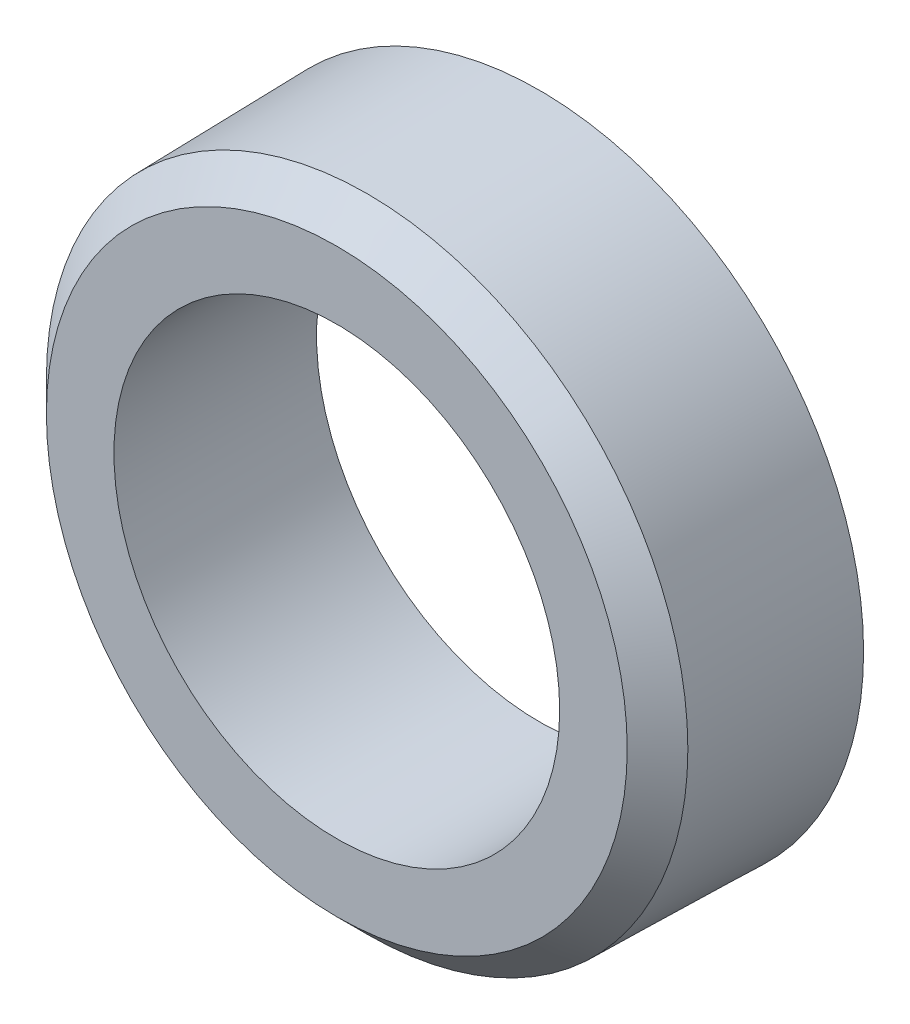
ISO-10303-21;
HEADER;
FILE_DESCRIPTION(('STEP AP214'),'2;1');
FILE_NAME('part.step','',(''),(''),'','','');
FILE_SCHEMA(('AUTOMOTIVE_DESIGN { 1 0 10303 214 1 1 1 1 }'));
ENDSEC;
DATA;
#1=APPLICATION_CONTEXT('core data for automotive mechanical design processes');
#2=APPLICATION_PROTOCOL_DEFINITION('international standard','automotive_design',2000,#1);
#3=PRODUCT_CONTEXT('',#1,'mechanical');
#4=PRODUCT('Part','Part','',(#3));
#5=PRODUCT_RELATED_PRODUCT_CATEGORY('part','',(#4));
#6=PRODUCT_DEFINITION_FORMATION('','',#4);
#7=PRODUCT_DEFINITION_CONTEXT('part definition',#1,'design');
#8=PRODUCT_DEFINITION('design','',#6,#7);
#9=PRODUCT_DEFINITION_SHAPE('','',#8);
#10=(LENGTH_UNIT() NAMED_UNIT(*) SI_UNIT(.MILLI.,.METRE.));
#11=(NAMED_UNIT(*) PLANE_ANGLE_UNIT() SI_UNIT($,.RADIAN.));
#12=(NAMED_UNIT(*) SI_UNIT($,.STERADIAN.) SOLID_ANGLE_UNIT());
#13=UNCERTAINTY_MEASURE_WITH_UNIT(LENGTH_MEASURE(1.E-05),#10,'distance_accuracy_value','');
#14=(GEOMETRIC_REPRESENTATION_CONTEXT(3) GLOBAL_UNCERTAINTY_ASSIGNED_CONTEXT((#13)) GLOBAL_UNIT_ASSIGNED_CONTEXT((#10,
#11,#12)) REPRESENTATION_CONTEXT('',''));
#15=CARTESIAN_POINT('',(0.,0.,0.));
#16=DIRECTION('',(0.,0.,1.));
#17=DIRECTION('',(1.,0.,0.));
#18=AXIS2_PLACEMENT_3D('',#15,#16,#17);
#19=CARTESIAN_POINT('',(0.,0.,6.));
#20=DIRECTION('',(0.,0.,-1.));
#21=DIRECTION('',(-1.,0.,0.));
#22=AXIS2_PLACEMENT_3D('',#19,#20,#21);
#23=CONICAL_SURFACE('',#22,8.6,0.785398163397446);
#24=CARTESIAN_POINT('',(0.,0.,6.));
#25=DIRECTION('',(0.,0.,1.));
#26=DIRECTION('',(1.,0.,0.));
#27=AXIS2_PLACEMENT_3D('',#24,#25,#26);
#28=CIRCLE('',#27,8.6);
#29=CARTESIAN_POINT('',(8.6,0.,6.));
#30=VERTEX_POINT('',#29);
#31=EDGE_CURVE('E10',#30,#30,#28,.T.);
#32=ORIENTED_EDGE('',*,*,#31,.F.);
#33=EDGE_LOOP('',(#32));
#34=FACE_BOUND('',#33,.T.);
#35=CARTESIAN_POINT('',(0.,0.,5.10204081632652));
#36=DIRECTION('',(0.,0.,1.));
#37=DIRECTION('',(1.,0.,0.));
#38=AXIS2_PLACEMENT_3D('',#35,#36,#37);
#39=CIRCLE('',#38,9.49795918367347);
#40=CARTESIAN_POINT('',(9.49795918367347,0.,5.10204081632652));
#41=VERTEX_POINT('',#40);
#42=EDGE_CURVE('E31',#41,#41,#39,.T.);
#43=ORIENTED_EDGE('',*,*,#42,.T.);
#44=EDGE_LOOP('',(#43));
#45=FACE_BOUND('',#44,.T.);
#46=ADVANCED_FACE('F27',(#34,#45),#23,.T.);
#47=CARTESIAN_POINT('',(0.,0.,6.));
#48=DIRECTION('',(0.,0.,1.));
#49=DIRECTION('',(1.,0.,0.));
#50=AXIS2_PLACEMENT_3D('',#47,#48,#49);
#51=PLANE('',#50);
#52=ORIENTED_EDGE('',*,*,#31,.T.);
#53=EDGE_LOOP('',(#52));
#54=FACE_BOUND('',#53,.T.);
#55=CARTESIAN_POINT('',(0.,0.,6.));
#56=DIRECTION('',(0.,0.,1.));
#57=DIRECTION('',(1.,0.,0.));
#58=AXIS2_PLACEMENT_3D('',#55,#56,#57);
#59=CIRCLE('',#58,6.6);
#60=CARTESIAN_POINT('',(6.6,0.,6.));
#61=VERTEX_POINT('',#60);
#62=EDGE_CURVE('E35',#61,#61,#59,.T.);
#63=ORIENTED_EDGE('',*,*,#62,.F.);
#64=EDGE_LOOP('',(#63));
#65=FACE_BOUND('',#64,.T.);
#66=ADVANCED_FACE('F29',(#54,#65),#51,.T.);
#67=CARTESIAN_POINT('',(0.,0.,0.));
#68=DIRECTION('',(0.,0.,1.));
#69=DIRECTION('',(1.,0.,0.));
#70=AXIS2_PLACEMENT_3D('',#67,#68,#69);
#71=PLANE('',#70);
#72=CARTESIAN_POINT('',(0.,0.,0.));
#73=DIRECTION('',(0.,0.,1.));
#74=DIRECTION('',(1.,0.,0.));
#75=AXIS2_PLACEMENT_3D('',#72,#73,#74);
#76=CIRCLE('',#75,9.6);
#77=CARTESIAN_POINT('',(9.6,0.,0.));
#78=VERTEX_POINT('',#77);
#79=EDGE_CURVE('E44',#78,#78,#76,.T.);
#80=ORIENTED_EDGE('',*,*,#79,.F.);
#81=EDGE_LOOP('',(#80));
#82=FACE_BOUND('',#81,.T.);
#83=CARTESIAN_POINT('',(0.,0.,0.));
#84=DIRECTION('',(0.,0.,1.));
#85=DIRECTION('',(1.,0.,0.));
#86=AXIS2_PLACEMENT_3D('',#83,#84,#85);
#87=CIRCLE('',#86,6.6);
#88=CARTESIAN_POINT('',(6.6,0.,0.));
#89=VERTEX_POINT('',#88);
#90=EDGE_CURVE('E39',#89,#89,#87,.T.);
#91=ORIENTED_EDGE('',*,*,#90,.T.);
#92=EDGE_LOOP('',(#91));
#93=FACE_BOUND('',#92,.T.);
#94=ADVANCED_FACE('F60',(#82,#93),#71,.F.);
#95=CARTESIAN_POINT('',(0.,0.,6.));
#96=DIRECTION('',(0.,0.,-1.));
#97=DIRECTION('',(-1.,0.,0.));
#98=AXIS2_PLACEMENT_3D('',#95,#96,#97);
#99=CYLINDRICAL_SURFACE('',#98,6.6);
#100=ORIENTED_EDGE('',*,*,#62,.T.);
#101=EDGE_LOOP('',(#100));
#102=FACE_BOUND('',#101,.T.);
#103=ORIENTED_EDGE('',*,*,#90,.F.);
#104=EDGE_LOOP('',(#103));
#105=FACE_BOUND('',#104,.T.);
#106=ADVANCED_FACE('F54',(#102,#105),#99,.F.);
#107=CARTESIAN_POINT('',(0.,0.,6.));
#108=DIRECTION('',(0.,0.,-1.));
#109=DIRECTION('',(-1.,0.,0.));
#110=AXIS2_PLACEMENT_3D('',#107,#108,#109);
#111=CONICAL_SURFACE('',#110,9.48,0.0199973339731503);
#112=ORIENTED_EDGE('',*,*,#42,.F.);
#113=EDGE_LOOP('',(#112));
#114=FACE_BOUND('',#113,.T.);
#115=ORIENTED_EDGE('',*,*,#79,.T.);
#116=EDGE_LOOP('',(#115));
#117=FACE_BOUND('',#116,.T.);
#118=ADVANCED_FACE('F52',(#114,#117),#111,.T.);
#119=CLOSED_SHELL('',(#46,#66,#94,#106,#118));
#120=MANIFOLD_SOLID_BREP('B2',#119);
#121=ADVANCED_BREP_SHAPE_REPRESENTATION('',(#18,#120),#14);
#122=SHAPE_DEFINITION_REPRESENTATION(#9,#121);
ENDSEC;
END-ISO-10303-21;
